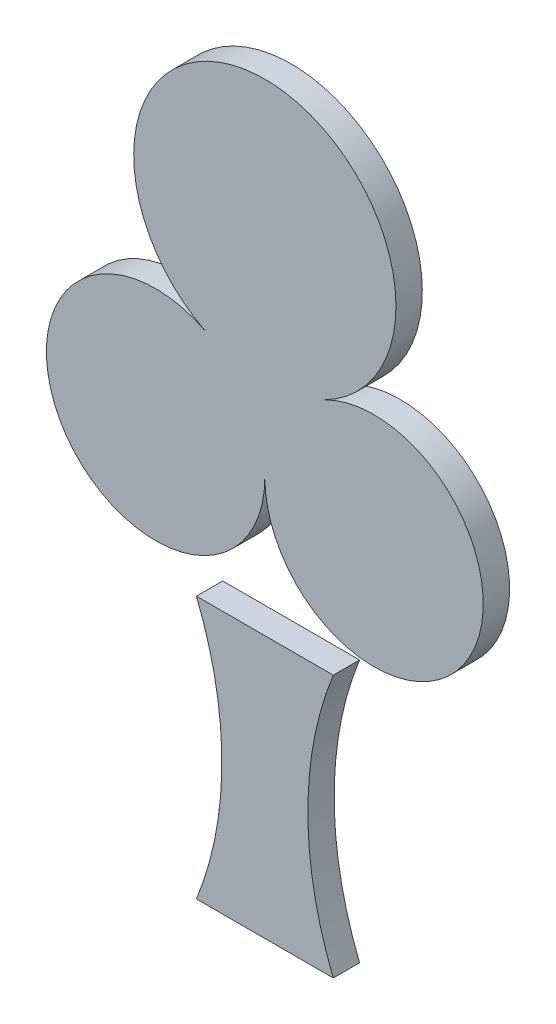
ISO-10303-21;
HEADER;
FILE_DESCRIPTION(('STEP AP214'),'2;1');
FILE_NAME('part.step','',(''),(''),'','','');
FILE_SCHEMA(('AUTOMOTIVE_DESIGN { 1 0 10303 214 1 1 1 1 }'));
ENDSEC;
DATA;
#1=APPLICATION_CONTEXT('core data for automotive mechanical design processes');
#2=APPLICATION_PROTOCOL_DEFINITION('international standard','automotive_design',2000,#1);
#3=PRODUCT_CONTEXT('',#1,'mechanical');
#4=PRODUCT('Part','Part','',(#3));
#5=PRODUCT_RELATED_PRODUCT_CATEGORY('part','',(#4));
#6=PRODUCT_DEFINITION_FORMATION('','',#4);
#7=PRODUCT_DEFINITION_CONTEXT('part definition',#1,'design');
#8=PRODUCT_DEFINITION('design','',#6,#7);
#9=PRODUCT_DEFINITION_SHAPE('','',#8);
#10=(LENGTH_UNIT() NAMED_UNIT(*) SI_UNIT(.MILLI.,.METRE.));
#11=(NAMED_UNIT(*) PLANE_ANGLE_UNIT() SI_UNIT($,.RADIAN.));
#12=(NAMED_UNIT(*) SI_UNIT($,.STERADIAN.) SOLID_ANGLE_UNIT());
#13=UNCERTAINTY_MEASURE_WITH_UNIT(LENGTH_MEASURE(1.E-05),#10,'distance_accuracy_value','');
#14=(GEOMETRIC_REPRESENTATION_CONTEXT(3) GLOBAL_UNCERTAINTY_ASSIGNED_CONTEXT((#13)) GLOBAL_UNIT_ASSIGNED_CONTEXT((#10,
#11,#12)) REPRESENTATION_CONTEXT('',''));
#15=CARTESIAN_POINT('',(0.,0.,0.));
#16=DIRECTION('',(0.,0.,1.));
#17=DIRECTION('',(1.,0.,0.));
#18=AXIS2_PLACEMENT_3D('',#15,#16,#17);
#19=CARTESIAN_POINT('',(44.8849137931034,3.33066907387547E-13,3.));
#20=DIRECTION('',(0.,0.,-1.));
#21=DIRECTION('',(-1.,0.,0.));
#22=AXIS2_PLACEMENT_3D('',#19,#20,#21);
#23=CYLINDRICAL_SURFACE('',#22,39.9849137931034);
#24=CARTESIAN_POINT('',(44.8849137931034,3.33066907387547E-13,0.));
#25=DIRECTION('',(0.,0.,1.));
#26=DIRECTION('',(1.,0.,0.));
#27=AXIS2_PLACEMENT_3D('',#24,#25,#26);
#28=CIRCLE('',#27,39.9849137931034);
#29=CARTESIAN_POINT('',(7.7999999999999,14.95,0.));
#30=VERTEX_POINT('',#29);
#31=CARTESIAN_POINT('',(7.8000000000001,-14.95,0.));
#32=VERTEX_POINT('',#31);
#33=EDGE_CURVE('E124',#30,#32,#28,.T.);
#34=ORIENTED_EDGE('',*,*,#33,.F.);
#35=DIRECTION('',(0.,0.,-1.));
#36=VECTOR('',#35,1.);
#37=CARTESIAN_POINT('',(7.7999999999999,14.95,3.));
#38=LINE('',#37,#36);
#39=CARTESIAN_POINT('',(7.7999999999999,14.95,3.));
#40=VERTEX_POINT('',#39);
#41=EDGE_CURVE('E12',#40,#30,#38,.T.);
#42=ORIENTED_EDGE('',*,*,#41,.F.);
#43=CARTESIAN_POINT('',(44.8849137931034,3.33066907387547E-13,3.));
#44=DIRECTION('',(0.,0.,1.));
#45=DIRECTION('',(1.,0.,0.));
#46=AXIS2_PLACEMENT_3D('',#43,#44,#45);
#47=CIRCLE('',#46,39.9849137931034);
#48=CARTESIAN_POINT('',(7.8000000000001,-14.95,3.));
#49=VERTEX_POINT('',#48);
#50=EDGE_CURVE('E118',#40,#49,#47,.T.);
#51=ORIENTED_EDGE('',*,*,#50,.T.);
#52=DIRECTION('',(0.,0.,-1.));
#53=VECTOR('',#52,1.);
#54=CARTESIAN_POINT('',(7.8000000000001,-14.95,3.));
#55=LINE('',#54,#53);
#56=EDGE_CURVE('E99',#49,#32,#55,.T.);
#57=ORIENTED_EDGE('',*,*,#56,.T.);
#58=EDGE_LOOP('',(#34,#42,#51,#57));
#59=FACE_BOUND('',#58,.T.);
#60=ADVANCED_FACE('F61',(#59),#23,.F.);
#61=CARTESIAN_POINT('',(0.,14.95,3.));
#62=DIRECTION('',(0.,1.,0.));
#63=DIRECTION('',(0.,0.,1.));
#64=AXIS2_PLACEMENT_3D('',#61,#62,#63);
#65=PLANE('',#64);
#66=DIRECTION('',(1.,0.,0.));
#67=VECTOR('',#66,1.);
#68=CARTESIAN_POINT('',(0.,14.95,0.));
#69=LINE('',#68,#67);
#70=CARTESIAN_POINT('',(-7.8,14.95,0.));
#71=VERTEX_POINT('',#70);
#72=EDGE_CURVE('E112',#71,#30,#69,.T.);
#73=ORIENTED_EDGE('',*,*,#72,.F.);
#74=DIRECTION('',(0.,0.,-1.));
#75=VECTOR('',#74,1.);
#76=CARTESIAN_POINT('',(-7.8,14.95,3.));
#77=LINE('',#76,#75);
#78=CARTESIAN_POINT('',(-7.8,14.95,3.));
#79=VERTEX_POINT('',#78);
#80=EDGE_CURVE('E69',#79,#71,#77,.T.);
#81=ORIENTED_EDGE('',*,*,#80,.F.);
#82=DIRECTION('',(1.,0.,0.));
#83=VECTOR('',#82,1.);
#84=CARTESIAN_POINT('',(0.,14.95,3.));
#85=LINE('',#84,#83);
#86=EDGE_CURVE('E110',#79,#40,#85,.T.);
#87=ORIENTED_EDGE('',*,*,#86,.T.);
#88=ORIENTED_EDGE('',*,*,#41,.T.);
#89=EDGE_LOOP('',(#73,#81,#87,#88));
#90=FACE_BOUND('',#89,.T.);
#91=ADVANCED_FACE('F108',(#90),#65,.T.);
#92=CARTESIAN_POINT('',(-44.8849137931034,0.,3.));
#93=DIRECTION('',(0.,0.,-1.));
#94=DIRECTION('',(-1.,0.,0.));
#95=AXIS2_PLACEMENT_3D('',#92,#93,#94);
#96=CYLINDRICAL_SURFACE('',#95,39.9849137931034);
#97=CARTESIAN_POINT('',(-44.8849137931034,0.,0.));
#98=DIRECTION('',(0.,0.,1.));
#99=DIRECTION('',(1.,0.,0.));
#100=AXIS2_PLACEMENT_3D('',#97,#98,#99);
#101=CIRCLE('',#100,39.9849137931034);
#102=CARTESIAN_POINT('',(-7.8,-14.95,0.));
#103=VERTEX_POINT('',#102);
#104=EDGE_CURVE('E92',#71,#103,#101,.F.);
#105=ORIENTED_EDGE('',*,*,#104,.T.);
#106=DIRECTION('',(0.,0.,-1.));
#107=VECTOR('',#106,1.);
#108=CARTESIAN_POINT('',(-7.8,-14.95,3.));
#109=LINE('',#108,#107);
#110=CARTESIAN_POINT('',(-7.8,-14.95,3.));
#111=VERTEX_POINT('',#110);
#112=EDGE_CURVE('E113',#111,#103,#109,.T.);
#113=ORIENTED_EDGE('',*,*,#112,.F.);
#114=CARTESIAN_POINT('',(-44.8849137931034,0.,3.));
#115=DIRECTION('',(0.,0.,1.));
#116=DIRECTION('',(1.,0.,0.));
#117=AXIS2_PLACEMENT_3D('',#114,#115,#116);
#118=CIRCLE('',#117,39.9849137931034);
#119=EDGE_CURVE('E114',#79,#111,#118,.F.);
#120=ORIENTED_EDGE('',*,*,#119,.F.);
#121=ORIENTED_EDGE('',*,*,#80,.T.);
#122=EDGE_LOOP('',(#105,#113,#120,#121));
#123=FACE_BOUND('',#122,.T.);
#124=ADVANCED_FACE('F115',(#123),#96,.F.);
#125=CARTESIAN_POINT('',(0.,-14.95,3.));
#126=DIRECTION('',(0.,1.,0.));
#127=DIRECTION('',(0.,0.,1.));
#128=AXIS2_PLACEMENT_3D('',#125,#126,#127);
#129=PLANE('',#128);
#130=DIRECTION('',(1.,0.,0.));
#131=VECTOR('',#130,1.);
#132=CARTESIAN_POINT('',(0.,-14.95,0.));
#133=LINE('',#132,#131);
#134=EDGE_CURVE('E120',#103,#32,#133,.T.);
#135=ORIENTED_EDGE('',*,*,#134,.T.);
#136=ORIENTED_EDGE('',*,*,#56,.F.);
#137=DIRECTION('',(1.,0.,0.));
#138=VECTOR('',#137,1.);
#139=CARTESIAN_POINT('',(0.,-14.95,3.));
#140=LINE('',#139,#138);
#141=EDGE_CURVE('E77',#111,#49,#140,.T.);
#142=ORIENTED_EDGE('',*,*,#141,.F.);
#143=ORIENTED_EDGE('',*,*,#112,.T.);
#144=EDGE_LOOP('',(#135,#136,#142,#143));
#145=FACE_BOUND('',#144,.T.);
#146=ADVANCED_FACE('F133',(#145),#129,.F.);
#147=CARTESIAN_POINT('',(0.,0.,3.));
#148=DIRECTION('',(0.,0.,1.));
#149=DIRECTION('',(1.,0.,0.));
#150=AXIS2_PLACEMENT_3D('',#147,#148,#149);
#151=PLANE('',#150);
#152=ORIENTED_EDGE('',*,*,#50,.F.);
#153=ORIENTED_EDGE('',*,*,#86,.F.);
#154=ORIENTED_EDGE('',*,*,#119,.T.);
#155=ORIENTED_EDGE('',*,*,#141,.T.);
#156=EDGE_LOOP('',(#152,#153,#154,#155));
#157=FACE_BOUND('',#156,.T.);
#158=ADVANCED_FACE('F117',(#157),#151,.T.);
#159=CARTESIAN_POINT('',(0.,0.,0.));
#160=DIRECTION('',(0.,0.,1.));
#161=DIRECTION('',(1.,0.,0.));
#162=AXIS2_PLACEMENT_3D('',#159,#160,#161);
#163=PLANE('',#162);
#164=ORIENTED_EDGE('',*,*,#33,.T.);
#165=ORIENTED_EDGE('',*,*,#134,.F.);
#166=ORIENTED_EDGE('',*,*,#104,.F.);
#167=ORIENTED_EDGE('',*,*,#72,.T.);
#168=EDGE_LOOP('',(#164,#165,#166,#167));
#169=FACE_BOUND('',#168,.T.);
#170=ADVANCED_FACE('F135',(#169),#163,.F.);
#171=CLOSED_SHELL('',(#60,#91,#124,#146,#158,#170));
#172=MANIFOLD_SOLID_BREP('B2',#171);
#173=CARTESIAN_POINT('',(0.,54.95,3.));
#174=DIRECTION('',(0.,0.,-1.));
#175=DIRECTION('',(-1.,0.,0.));
#176=AXIS2_PLACEMENT_3D('',#173,#174,#175);
#177=CYLINDRICAL_SURFACE('',#176,14.95);
#178=CARTESIAN_POINT('',(0.,54.95,0.));
#179=DIRECTION('',(0.,0.,1.));
#180=DIRECTION('',(1.,0.,0.));
#181=AXIS2_PLACEMENT_3D('',#178,#179,#180);
#182=CIRCLE('',#181,14.95);
#183=CARTESIAN_POINT('',(6.79297445255475,41.6324177086478,0.));
#184=VERTEX_POINT('',#183);
#185=CARTESIAN_POINT('',(-6.79297445255475,41.6324177086478,0.));
#186=VERTEX_POINT('',#185);
#187=EDGE_CURVE('E259',#184,#186,#182,.T.);
#188=ORIENTED_EDGE('',*,*,#187,.T.);
#189=DIRECTION('',(0.,0.,-1.));
#190=VECTOR('',#189,1.);
#191=CARTESIAN_POINT('',(-6.79297445255475,41.6324177086478,3.));
#192=LINE('',#191,#190);
#193=CARTESIAN_POINT('',(-6.79297445255475,41.6324177086478,3.));
#194=VERTEX_POINT('',#193);
#195=EDGE_CURVE('E59',#194,#186,#192,.T.);
#196=ORIENTED_EDGE('',*,*,#195,.F.);
#197=CARTESIAN_POINT('',(0.,54.95,3.));
#198=DIRECTION('',(0.,0.,1.));
#199=DIRECTION('',(1.,0.,0.));
#200=AXIS2_PLACEMENT_3D('',#197,#198,#199);
#201=CIRCLE('',#200,14.95);
#202=CARTESIAN_POINT('',(6.79297445255475,41.6324177086478,3.));
#203=VERTEX_POINT('',#202);
#204=EDGE_CURVE('E251',#203,#194,#201,.T.);
#205=ORIENTED_EDGE('',*,*,#204,.F.);
#206=DIRECTION('',(0.,0.,-1.));
#207=VECTOR('',#206,1.);
#208=CARTESIAN_POINT('',(6.79297445255475,41.6324177086478,3.));
#209=LINE('',#208,#207);
#210=EDGE_CURVE('E260',#203,#184,#209,.T.);
#211=ORIENTED_EDGE('',*,*,#210,.T.);
#212=EDGE_LOOP('',(#188,#196,#205,#211));
#213=FACE_BOUND('',#212,.T.);
#214=ADVANCED_FACE('F209',(#213),#177,.T.);
#215=CARTESIAN_POINT('',(-12.45,30.5418558673544,3.));
#216=DIRECTION('',(0.,0.,-1.));
#217=DIRECTION('',(-1.,0.,0.));
#218=AXIS2_PLACEMENT_3D('',#215,#216,#217);
#219=CYLINDRICAL_SURFACE('',#218,12.45);
#220=CARTESIAN_POINT('',(-12.45,30.5418558673544,0.));
#221=DIRECTION('',(0.,0.,1.));
#222=DIRECTION('',(1.,0.,0.));
#223=AXIS2_PLACEMENT_3D('',#220,#221,#222);
#224=CIRCLE('',#223,12.45);
#225=CARTESIAN_POINT('',(0.,30.5418558673544,0.));
#226=VERTEX_POINT('',#225);
#227=EDGE_CURVE('E238',#186,#226,#224,.T.);
#228=ORIENTED_EDGE('',*,*,#227,.T.);
#229=DIRECTION('',(0.,0.,-1.));
#230=VECTOR('',#229,1.);
#231=CARTESIAN_POINT('',(0.,30.5418558673544,3.));
#232=LINE('',#231,#230);
#233=CARTESIAN_POINT('',(0.,30.5418558673544,3.));
#234=VERTEX_POINT('',#233);
#235=EDGE_CURVE('E218',#234,#226,#232,.T.);
#236=ORIENTED_EDGE('',*,*,#235,.F.);
#237=CARTESIAN_POINT('',(-12.45,30.5418558673544,3.));
#238=DIRECTION('',(0.,0.,1.));
#239=DIRECTION('',(1.,0.,0.));
#240=AXIS2_PLACEMENT_3D('',#237,#238,#239);
#241=CIRCLE('',#240,12.45);
#242=EDGE_CURVE('E246',#194,#234,#241,.T.);
#243=ORIENTED_EDGE('',*,*,#242,.F.);
#244=ORIENTED_EDGE('',*,*,#195,.T.);
#245=EDGE_LOOP('',(#228,#236,#243,#244));
#246=FACE_BOUND('',#245,.T.);
#247=ADVANCED_FACE('F247',(#246),#219,.T.);
#248=CARTESIAN_POINT('',(12.45,30.5418558673544,3.));
#249=DIRECTION('',(0.,0.,-1.));
#250=DIRECTION('',(-1.,0.,0.));
#251=AXIS2_PLACEMENT_3D('',#248,#249,#250);
#252=CYLINDRICAL_SURFACE('',#251,12.45);
#253=CARTESIAN_POINT('',(12.45,30.5418558673544,0.));
#254=DIRECTION('',(0.,0.,1.));
#255=DIRECTION('',(1.,0.,0.));
#256=AXIS2_PLACEMENT_3D('',#253,#254,#255);
#257=CIRCLE('',#256,12.45);
#258=EDGE_CURVE('E243',#226,#184,#257,.T.);
#259=ORIENTED_EDGE('',*,*,#258,.T.);
#260=ORIENTED_EDGE('',*,*,#210,.F.);
#261=CARTESIAN_POINT('',(12.45,30.5418558673544,3.));
#262=DIRECTION('',(0.,0.,1.));
#263=DIRECTION('',(1.,0.,0.));
#264=AXIS2_PLACEMENT_3D('',#261,#262,#263);
#265=CIRCLE('',#264,12.45);
#266=EDGE_CURVE('E226',#234,#203,#265,.T.);
#267=ORIENTED_EDGE('',*,*,#266,.F.);
#268=ORIENTED_EDGE('',*,*,#235,.T.);
#269=EDGE_LOOP('',(#259,#260,#267,#268));
#270=FACE_BOUND('',#269,.T.);
#271=ADVANCED_FACE('F272',(#270),#252,.T.);
#272=CARTESIAN_POINT('',(0.,0.,3.));
#273=DIRECTION('',(0.,0.,1.));
#274=DIRECTION('',(1.,0.,0.));
#275=AXIS2_PLACEMENT_3D('',#272,#273,#274);
#276=PLANE('',#275);
#277=ORIENTED_EDGE('',*,*,#204,.T.);
#278=ORIENTED_EDGE('',*,*,#242,.T.);
#279=ORIENTED_EDGE('',*,*,#266,.T.);
#280=EDGE_LOOP('',(#277,#278,#279));
#281=FACE_BOUND('',#280,.T.);
#282=ADVANCED_FACE('F254',(#281),#276,.T.);
#283=CARTESIAN_POINT('',(0.,0.,0.));
#284=DIRECTION('',(0.,0.,1.));
#285=DIRECTION('',(1.,0.,0.));
#286=AXIS2_PLACEMENT_3D('',#283,#284,#285);
#287=PLANE('',#286);
#288=ORIENTED_EDGE('',*,*,#187,.F.);
#289=ORIENTED_EDGE('',*,*,#258,.F.);
#290=ORIENTED_EDGE('',*,*,#227,.F.);
#291=EDGE_LOOP('',(#288,#289,#290));
#292=FACE_BOUND('',#291,.T.);
#293=ADVANCED_FACE('F273',(#292),#287,.F.);
#294=CLOSED_SHELL('',(#214,#247,#271,#282,#293));
#295=MANIFOLD_SOLID_BREP('B6',#294);
#296=ADVANCED_BREP_SHAPE_REPRESENTATION('',(#18,#172,#295),#14);
#297=SHAPE_DEFINITION_REPRESENTATION(#9,#296);
ENDSEC;
END-ISO-10303-21;
